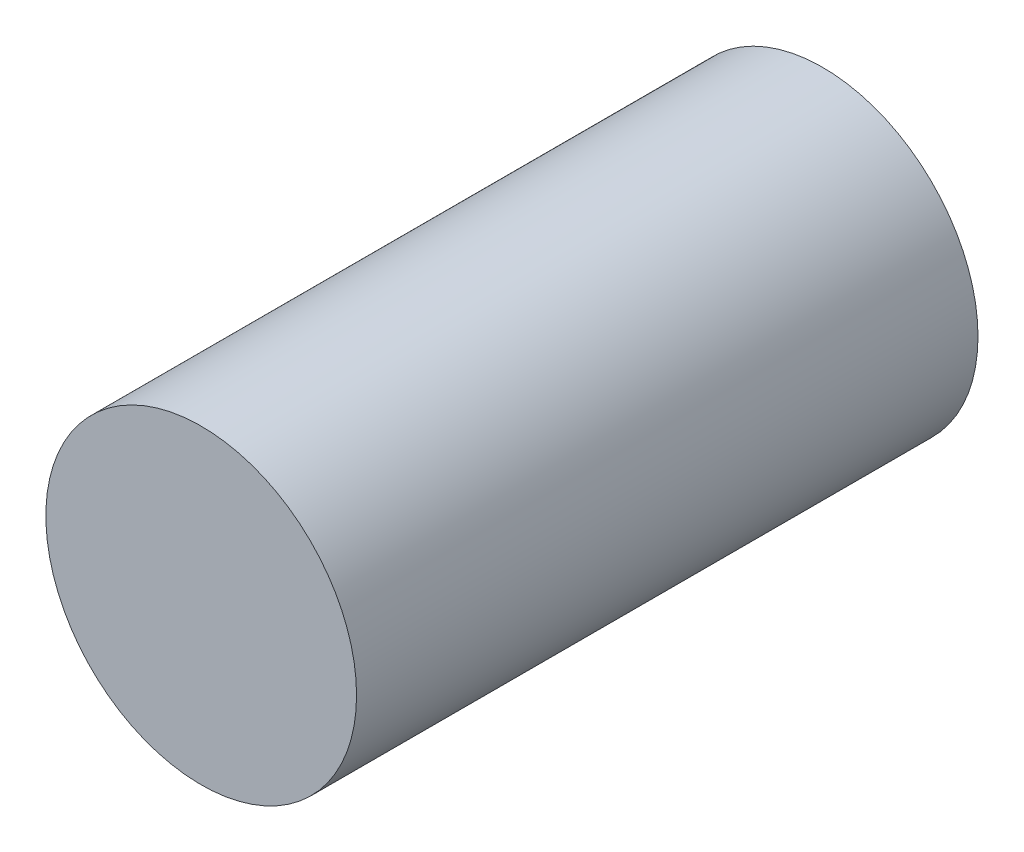
ISO-10303-21;
HEADER;
FILE_DESCRIPTION(('STEP AP214'),'2;1');
FILE_NAME('part.step','',(''),(''),'','','');
FILE_SCHEMA(('AUTOMOTIVE_DESIGN { 1 0 10303 214 1 1 1 1 }'));
ENDSEC;
DATA;
#1=APPLICATION_CONTEXT('core data for automotive mechanical design processes');
#2=APPLICATION_PROTOCOL_DEFINITION('international standard','automotive_design',2000,#1);
#3=PRODUCT_CONTEXT('',#1,'mechanical');
#4=PRODUCT('Part','Part','',(#3));
#5=PRODUCT_RELATED_PRODUCT_CATEGORY('part','',(#4));
#6=PRODUCT_DEFINITION_FORMATION('','',#4);
#7=PRODUCT_DEFINITION_CONTEXT('part definition',#1,'design');
#8=PRODUCT_DEFINITION('design','',#6,#7);
#9=PRODUCT_DEFINITION_SHAPE('','',#8);
#10=(LENGTH_UNIT() NAMED_UNIT(*) SI_UNIT(.MILLI.,.METRE.));
#11=(NAMED_UNIT(*) PLANE_ANGLE_UNIT() SI_UNIT($,.RADIAN.));
#12=(NAMED_UNIT(*) SI_UNIT($,.STERADIAN.) SOLID_ANGLE_UNIT());
#13=UNCERTAINTY_MEASURE_WITH_UNIT(LENGTH_MEASURE(1.E-05),#10,'distance_accuracy_value','');
#14=(GEOMETRIC_REPRESENTATION_CONTEXT(3) GLOBAL_UNCERTAINTY_ASSIGNED_CONTEXT((#13)) GLOBAL_UNIT_ASSIGNED_CONTEXT((#10,
#11,#12)) REPRESENTATION_CONTEXT('',''));
#15=CARTESIAN_POINT('',(0.,0.,0.));
#16=DIRECTION('',(0.,0.,1.));
#17=DIRECTION('',(1.,0.,0.));
#18=AXIS2_PLACEMENT_3D('',#15,#16,#17);
#19=CARTESIAN_POINT('',(0.,0.,50.8));
#20=DIRECTION('',(0.,0.,-1.));
#21=DIRECTION('',(-1.,0.,0.));
#22=AXIS2_PLACEMENT_3D('',#19,#20,#21);
#23=CYLINDRICAL_SURFACE('',#22,12.7);
#24=CARTESIAN_POINT('',(0.,0.,50.8));
#25=DIRECTION('',(0.,0.,1.));
#26=DIRECTION('',(1.,0.,0.));
#27=AXIS2_PLACEMENT_3D('',#24,#25,#26);
#28=CIRCLE('',#27,12.7);
#29=CARTESIAN_POINT('',(12.7,0.,50.8));
#30=VERTEX_POINT('',#29);
#31=EDGE_CURVE('E10',#30,#30,#28,.T.);
#32=ORIENTED_EDGE('',*,*,#31,.F.);
#33=EDGE_LOOP('',(#32));
#34=FACE_BOUND('',#33,.T.);
#35=CARTESIAN_POINT('',(0.,0.,0.));
#36=DIRECTION('',(0.,0.,1.));
#37=DIRECTION('',(1.,0.,0.));
#38=AXIS2_PLACEMENT_3D('',#35,#36,#37);
#39=CIRCLE('',#38,12.7);
#40=CARTESIAN_POINT('',(12.7,0.,0.));
#41=VERTEX_POINT('',#40);
#42=EDGE_CURVE('E38',#41,#41,#39,.T.);
#43=ORIENTED_EDGE('',*,*,#42,.T.);
#44=EDGE_LOOP('',(#43));
#45=FACE_BOUND('',#44,.T.);
#46=ADVANCED_FACE('F35',(#34,#45),#23,.T.);
#47=CARTESIAN_POINT('',(0.,0.,50.8));
#48=DIRECTION('',(0.,0.,1.));
#49=DIRECTION('',(1.,0.,0.));
#50=AXIS2_PLACEMENT_3D('',#47,#48,#49);
#51=PLANE('',#50);
#52=ORIENTED_EDGE('',*,*,#31,.T.);
#53=EDGE_LOOP('',(#52));
#54=FACE_BOUND('',#53,.T.);
#55=ADVANCED_FACE('F50',(#54),#51,.T.);
#56=CARTESIAN_POINT('',(0.,0.,0.));
#57=DIRECTION('',(0.,0.,1.));
#58=DIRECTION('',(1.,0.,0.));
#59=AXIS2_PLACEMENT_3D('',#56,#57,#58);
#60=PLANE('',#59);
#61=ORIENTED_EDGE('',*,*,#42,.F.);
#62=EDGE_LOOP('',(#61));
#63=FACE_BOUND('',#62,.T.);
#64=ADVANCED_FACE('F48',(#63),#60,.F.);
#65=CLOSED_SHELL('',(#46,#55,#64));
#66=MANIFOLD_SOLID_BREP('B2',#65);
#67=ADVANCED_BREP_SHAPE_REPRESENTATION('',(#18,#66),#14);
#68=SHAPE_DEFINITION_REPRESENTATION(#9,#67);
ENDSEC;
END-ISO-10303-21;
